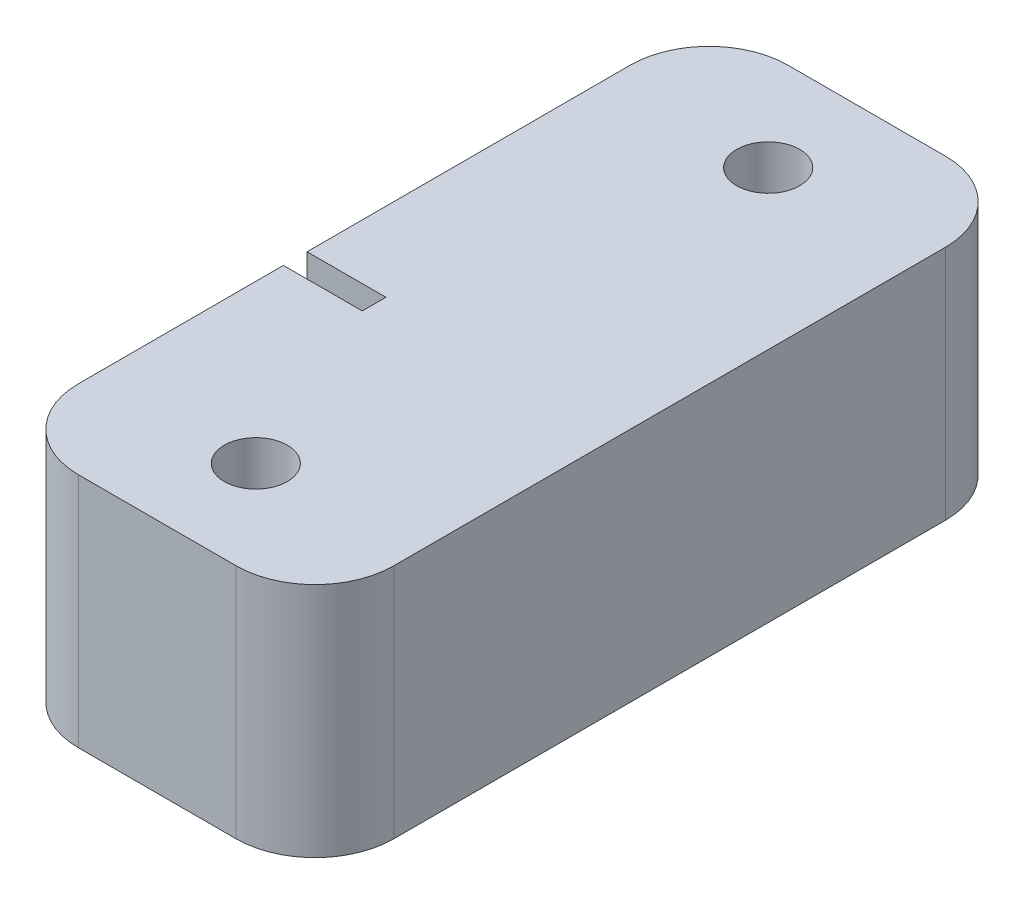
ISO-10303-21;
HEADER;
FILE_DESCRIPTION(('STEP AP214'),'2;1');
FILE_NAME('part.step','',(''),(''),'','','');
FILE_SCHEMA(('AUTOMOTIVE_DESIGN { 1 0 10303 214 1 1 1 1 }'));
ENDSEC;
DATA;
#1=APPLICATION_CONTEXT('core data for automotive mechanical design processes');
#2=APPLICATION_PROTOCOL_DEFINITION('international standard','automotive_design',2000,#1);
#3=PRODUCT_CONTEXT('',#1,'mechanical');
#4=PRODUCT('Part','Part','',(#3));
#5=PRODUCT_RELATED_PRODUCT_CATEGORY('part','',(#4));
#6=PRODUCT_DEFINITION_FORMATION('','',#4);
#7=PRODUCT_DEFINITION_CONTEXT('part definition',#1,'design');
#8=PRODUCT_DEFINITION('design','',#6,#7);
#9=PRODUCT_DEFINITION_SHAPE('','',#8);
#10=(LENGTH_UNIT() NAMED_UNIT(*) SI_UNIT(.MILLI.,.METRE.));
#11=(NAMED_UNIT(*) PLANE_ANGLE_UNIT() SI_UNIT($,.RADIAN.));
#12=(NAMED_UNIT(*) SI_UNIT($,.STERADIAN.) SOLID_ANGLE_UNIT());
#13=UNCERTAINTY_MEASURE_WITH_UNIT(LENGTH_MEASURE(1.E-05),#10,'distance_accuracy_value','');
#14=(GEOMETRIC_REPRESENTATION_CONTEXT(3) GLOBAL_UNCERTAINTY_ASSIGNED_CONTEXT((#13)) GLOBAL_UNIT_ASSIGNED_CONTEXT((#10,
#11,#12)) REPRESENTATION_CONTEXT('',''));
#15=CARTESIAN_POINT('',(0.,0.,0.));
#16=DIRECTION('',(0.,0.,1.));
#17=DIRECTION('',(1.,0.,0.));
#18=AXIS2_PLACEMENT_3D('',#15,#16,#17);
#19=CARTESIAN_POINT('',(-23.5223880597015,30.,-49.7611940298507));
#20=DIRECTION('',(1.,0.,0.));
#21=DIRECTION('',(0.,0.,-1.));
#22=AXIS2_PLACEMENT_3D('',#19,#20,#21);
#23=PLANE('',#22);
#24=DIRECTION('',(0.,0.,1.));
#25=VECTOR('',#24,1.);
#26=CARTESIAN_POINT('',(-23.5223880597015,30.,-49.7611940298507));
#27=LINE('',#26,#25);
#28=CARTESIAN_POINT('',(-23.5223880597015,30.,-39.7611940298507));
#29=VERTEX_POINT('',#28);
#30=CARTESIAN_POINT('',(-23.5223880597015,30.,1.23880597014926));
#31=VERTEX_POINT('',#30);
#32=EDGE_CURVE('E184',#29,#31,#27,.T.);
#33=ORIENTED_EDGE('',*,*,#32,.F.);
#34=DIRECTION('',(0.,-1.,0.));
#35=VECTOR('',#34,1.);
#36=CARTESIAN_POINT('',(-23.5223880597015,30.,-39.7611940298507));
#37=LINE('',#36,#35);
#38=CARTESIAN_POINT('',(-23.5223880597015,0.,-39.7611940298507));
#39=VERTEX_POINT('',#38);
#40=EDGE_CURVE('E206',#29,#39,#37,.T.);
#41=ORIENTED_EDGE('',*,*,#40,.T.);
#42=DIRECTION('',(0.,0.,1.));
#43=VECTOR('',#42,1.);
#44=CARTESIAN_POINT('',(-23.5223880597015,0.,-49.7611940298507));
#45=LINE('',#44,#43);
#46=CARTESIAN_POINT('',(-23.5223880597015,0.,30.2388059701492));
#47=VERTEX_POINT('',#46);
#48=EDGE_CURVE('E175',#39,#47,#45,.T.);
#49=ORIENTED_EDGE('',*,*,#48,.T.);
#50=DIRECTION('',(0.,-1.,0.));
#51=VECTOR('',#50,1.);
#52=CARTESIAN_POINT('',(-23.5223880597015,30.,30.2388059701492));
#53=LINE('',#52,#51);
#54=CARTESIAN_POINT('',(-23.5223880597015,30.,30.2388059701492));
#55=VERTEX_POINT('',#54);
#56=EDGE_CURVE('E194',#47,#55,#53,.F.);
#57=ORIENTED_EDGE('',*,*,#56,.T.);
#58=CARTESIAN_POINT('',(-23.5223880597015,30.,4.23880597014926));
#59=VERTEX_POINT('',#58);
#60=EDGE_CURVE('E187',#59,#55,#27,.T.);
#61=ORIENTED_EDGE('',*,*,#60,.F.);
#62=DIRECTION('',(0.,-1.,0.));
#63=VECTOR('',#62,1.);
#64=CARTESIAN_POINT('',(-23.5223880597015,0.,4.23880597014926));
#65=LINE('',#64,#63);
#66=CARTESIAN_POINT('',(-23.5223880597015,18.7080992435478,4.23880597014926));
#67=VERTEX_POINT('',#66);
#68=EDGE_CURVE('E153',#59,#67,#65,.T.);
#69=ORIENTED_EDGE('',*,*,#68,.T.);
#70=CARTESIAN_POINT('',(-23.5223880597015,15.,2.73880597014926));
#71=DIRECTION('',(-1.,0.,0.));
#72=DIRECTION('',(0.,0.,1.));
#73=AXIS2_PLACEMENT_3D('',#70,#71,#72);
#74=CIRCLE('',#73,4.);
#75=CARTESIAN_POINT('',(-23.5223880597015,18.7080992435478,1.23880597014926));
#76=VERTEX_POINT('',#75);
#77=EDGE_CURVE('E161',#76,#67,#74,.T.);
#78=ORIENTED_EDGE('',*,*,#77,.F.);
#79=DIRECTION('',(0.,-1.,0.));
#80=VECTOR('',#79,1.);
#81=CARTESIAN_POINT('',(-23.5223880597015,0.,1.23880597014926));
#82=LINE('',#81,#80);
#83=EDGE_CURVE('E131',#31,#76,#82,.T.);
#84=ORIENTED_EDGE('',*,*,#83,.F.);
#85=EDGE_LOOP('',(#33,#41,#49,#57,#61,#69,#78,#84));
#86=FACE_BOUND('',#85,.T.);
#87=ADVANCED_FACE('F34',(#86),#23,.F.);
#88=CARTESIAN_POINT('',(-23.5223880597015,30.,40.2388059701493));
#89=DIRECTION('',(0.,0.,-1.));
#90=DIRECTION('',(-1.,0.,0.));
#91=AXIS2_PLACEMENT_3D('',#88,#89,#90);
#92=PLANE('',#91);
#93=DIRECTION('',(1.,0.,0.));
#94=VECTOR('',#93,1.);
#95=CARTESIAN_POINT('',(-23.5223880597015,0.,40.2388059701493));
#96=LINE('',#95,#94);
#97=CARTESIAN_POINT('',(-13.5223880597015,0.,40.2388059701493));
#98=VERTEX_POINT('',#97);
#99=CARTESIAN_POINT('',(6.47761194029854,0.,40.2388059701493));
#100=VERTEX_POINT('',#99);
#101=EDGE_CURVE('E197',#98,#100,#96,.T.);
#102=ORIENTED_EDGE('',*,*,#101,.T.);
#103=DIRECTION('',(0.,-1.,0.));
#104=VECTOR('',#103,1.);
#105=CARTESIAN_POINT('',(6.47761194029854,30.,40.2388059701493));
#106=LINE('',#105,#104);
#107=CARTESIAN_POINT('',(6.47761194029854,30.,40.2388059701493));
#108=VERTEX_POINT('',#107);
#109=EDGE_CURVE('E11',#100,#108,#106,.F.);
#110=ORIENTED_EDGE('',*,*,#109,.T.);
#111=DIRECTION('',(1.,0.,0.));
#112=VECTOR('',#111,1.);
#113=CARTESIAN_POINT('',(-23.5223880597015,30.,40.2388059701493));
#114=LINE('',#113,#112);
#115=CARTESIAN_POINT('',(-13.5223880597015,30.,40.2388059701493));
#116=VERTEX_POINT('',#115);
#117=EDGE_CURVE('E186',#116,#108,#114,.T.);
#118=ORIENTED_EDGE('',*,*,#117,.F.);
#119=DIRECTION('',(0.,-1.,0.));
#120=VECTOR('',#119,1.);
#121=CARTESIAN_POINT('',(-13.5223880597015,30.,40.2388059701493));
#122=LINE('',#121,#120);
#123=EDGE_CURVE('E42',#116,#98,#122,.T.);
#124=ORIENTED_EDGE('',*,*,#123,.T.);
#125=EDGE_LOOP('',(#102,#110,#118,#124));
#126=FACE_BOUND('',#125,.T.);
#127=ADVANCED_FACE('F237',(#126),#92,.F.);
#128=CARTESIAN_POINT('',(16.4776119402985,30.,-49.7611940298507));
#129=DIRECTION('',(-1.,0.,0.));
#130=DIRECTION('',(0.,0.,1.));
#131=AXIS2_PLACEMENT_3D('',#128,#129,#130);
#132=PLANE('',#131);
#133=DIRECTION('',(0.,0.,-1.));
#134=VECTOR('',#133,1.);
#135=CARTESIAN_POINT('',(16.4776119402985,0.,-49.7611940298507));
#136=LINE('',#135,#134);
#137=CARTESIAN_POINT('',(16.4776119402985,0.,30.2388059701492));
#138=VERTEX_POINT('',#137);
#139=CARTESIAN_POINT('',(16.4776119402985,0.,-39.7611940298507));
#140=VERTEX_POINT('',#139);
#141=EDGE_CURVE('E200',#138,#140,#136,.T.);
#142=ORIENTED_EDGE('',*,*,#141,.T.);
#143=DIRECTION('',(0.,-1.,0.));
#144=VECTOR('',#143,1.);
#145=CARTESIAN_POINT('',(16.4776119402985,30.,-39.7611940298507));
#146=LINE('',#145,#144);
#147=CARTESIAN_POINT('',(16.4776119402985,30.,-39.7611940298507));
#148=VERTEX_POINT('',#147);
#149=EDGE_CURVE('E49',#140,#148,#146,.F.);
#150=ORIENTED_EDGE('',*,*,#149,.T.);
#151=DIRECTION('',(0.,0.,-1.));
#152=VECTOR('',#151,1.);
#153=CARTESIAN_POINT('',(16.4776119402985,30.,-49.7611940298507));
#154=LINE('',#153,#152);
#155=CARTESIAN_POINT('',(16.4776119402985,30.,30.2388059701492));
#156=VERTEX_POINT('',#155);
#157=EDGE_CURVE('E189',#156,#148,#154,.T.);
#158=ORIENTED_EDGE('',*,*,#157,.F.);
#159=DIRECTION('',(0.,-1.,0.));
#160=VECTOR('',#159,1.);
#161=CARTESIAN_POINT('',(16.4776119402985,30.,30.2388059701492));
#162=LINE('',#161,#160);
#163=EDGE_CURVE('E229',#156,#138,#162,.T.);
#164=ORIENTED_EDGE('',*,*,#163,.T.);
#165=EDGE_LOOP('',(#142,#150,#158,#164));
#166=FACE_BOUND('',#165,.T.);
#167=ADVANCED_FACE('F248',(#166),#132,.F.);
#168=CARTESIAN_POINT('',(-23.5223880597015,30.,-49.7611940298507));
#169=DIRECTION('',(0.,0.,1.));
#170=DIRECTION('',(1.,0.,0.));
#171=AXIS2_PLACEMENT_3D('',#168,#169,#170);
#172=PLANE('',#171);
#173=DIRECTION('',(-1.,0.,0.));
#174=VECTOR('',#173,1.);
#175=CARTESIAN_POINT('',(-23.5223880597015,0.,-49.7611940298507));
#176=LINE('',#175,#174);
#177=CARTESIAN_POINT('',(6.47761194029853,0.,-49.7611940298507));
#178=VERTEX_POINT('',#177);
#179=CARTESIAN_POINT('',(-13.5223880597015,0.,-49.7611940298507));
#180=VERTEX_POINT('',#179);
#181=EDGE_CURVE('E202',#178,#180,#176,.T.);
#182=ORIENTED_EDGE('',*,*,#181,.T.);
#183=DIRECTION('',(0.,-1.,0.));
#184=VECTOR('',#183,1.);
#185=CARTESIAN_POINT('',(-13.5223880597015,30.,-49.7611940298507));
#186=LINE('',#185,#184);
#187=CARTESIAN_POINT('',(-13.5223880597015,30.,-49.7611940298507));
#188=VERTEX_POINT('',#187);
#189=EDGE_CURVE('E220',#180,#188,#186,.F.);
#190=ORIENTED_EDGE('',*,*,#189,.T.);
#191=DIRECTION('',(-1.,0.,0.));
#192=VECTOR('',#191,1.);
#193=CARTESIAN_POINT('',(-23.5223880597015,30.,-49.7611940298507));
#194=LINE('',#193,#192);
#195=CARTESIAN_POINT('',(6.47761194029853,30.,-49.7611940298507));
#196=VERTEX_POINT('',#195);
#197=EDGE_CURVE('E191',#196,#188,#194,.T.);
#198=ORIENTED_EDGE('',*,*,#197,.F.);
#199=DIRECTION('',(0.,-1.,0.));
#200=VECTOR('',#199,1.);
#201=CARTESIAN_POINT('',(6.47761194029853,30.,-49.7611940298507));
#202=LINE('',#201,#200);
#203=EDGE_CURVE('E217',#196,#178,#202,.T.);
#204=ORIENTED_EDGE('',*,*,#203,.T.);
#205=EDGE_LOOP('',(#182,#190,#198,#204));
#206=FACE_BOUND('',#205,.T.);
#207=ADVANCED_FACE('F258',(#206),#172,.F.);
#208=CARTESIAN_POINT('',(0.,30.,0.));
#209=DIRECTION('',(0.,1.,0.));
#210=DIRECTION('',(0.,0.,1.));
#211=AXIS2_PLACEMENT_3D('',#208,#209,#210);
#212=PLANE('',#211);
#213=ORIENTED_EDGE('',*,*,#197,.T.);
#214=CARTESIAN_POINT('',(-13.5223880597015,30.,-39.7611940298507));
#215=DIRECTION('',(0.,1.,0.));
#216=DIRECTION('',(0.,0.,1.));
#217=AXIS2_PLACEMENT_3D('',#214,#215,#216);
#218=CIRCLE('',#217,10.);
#219=EDGE_CURVE('E227',#188,#29,#218,.T.);
#220=ORIENTED_EDGE('',*,*,#219,.T.);
#221=ORIENTED_EDGE('',*,*,#32,.T.);
#222=DIRECTION('',(-1.,0.,0.));
#223=VECTOR('',#222,1.);
#224=CARTESIAN_POINT('',(-13.5223880597015,30.,1.23880597014926));
#225=LINE('',#224,#223);
#226=CARTESIAN_POINT('',(-13.5223880597015,30.,1.23880597014926));
#227=VERTEX_POINT('',#226);
#228=EDGE_CURVE('E165',#227,#31,#225,.T.);
#229=ORIENTED_EDGE('',*,*,#228,.F.);
#230=DIRECTION('',(0.,0.,-1.));
#231=VECTOR('',#230,1.);
#232=CARTESIAN_POINT('',(-13.5223880597015,30.,0.));
#233=LINE('',#232,#231);
#234=CARTESIAN_POINT('',(-13.5223880597015,30.,4.23880597014926));
#235=VERTEX_POINT('',#234);
#236=EDGE_CURVE('E148',#235,#227,#233,.T.);
#237=ORIENTED_EDGE('',*,*,#236,.F.);
#238=DIRECTION('',(-1.,0.,0.));
#239=VECTOR('',#238,1.);
#240=CARTESIAN_POINT('',(-13.5223880597015,30.,4.23880597014926));
#241=LINE('',#240,#239);
#242=EDGE_CURVE('E168',#235,#59,#241,.T.);
#243=ORIENTED_EDGE('',*,*,#242,.T.);
#244=ORIENTED_EDGE('',*,*,#60,.T.);
#245=CARTESIAN_POINT('',(-13.5223880597015,30.,30.2388059701493));
#246=DIRECTION('',(0.,1.,0.));
#247=DIRECTION('',(0.,0.,1.));
#248=AXIS2_PLACEMENT_3D('',#245,#246,#247);
#249=CIRCLE('',#248,10.);
#250=EDGE_CURVE('E222',#55,#116,#249,.T.);
#251=ORIENTED_EDGE('',*,*,#250,.T.);
#252=ORIENTED_EDGE('',*,*,#117,.T.);
#253=CARTESIAN_POINT('',(6.47761194029854,30.,30.2388059701492));
#254=DIRECTION('',(0.,1.,0.));
#255=DIRECTION('',(0.,0.,1.));
#256=AXIS2_PLACEMENT_3D('',#253,#254,#255);
#257=CIRCLE('',#256,10.);
#258=EDGE_CURVE('E56',#108,#156,#257,.T.);
#259=ORIENTED_EDGE('',*,*,#258,.T.);
#260=ORIENTED_EDGE('',*,*,#157,.T.);
#261=CARTESIAN_POINT('',(6.47761194029853,30.,-39.7611940298507));
#262=DIRECTION('',(0.,1.,0.));
#263=DIRECTION('',(0.,0.,1.));
#264=AXIS2_PLACEMENT_3D('',#261,#262,#263);
#265=CIRCLE('',#264,10.);
#266=EDGE_CURVE('E225',#148,#196,#265,.T.);
#267=ORIENTED_EDGE('',*,*,#266,.T.);
#268=EDGE_LOOP('',(#213,#220,#221,#229,#237,#243,#244,#251,#252,#259,#260,#267));
#269=FACE_BOUND('',#268,.T.);
#270=CARTESIAN_POINT('',(-3.52238805970146,30.,-37.2611940298507));
#271=DIRECTION('',(0.,1.,0.));
#272=DIRECTION('',(0.,0.,1.));
#273=AXIS2_PLACEMENT_3D('',#270,#271,#272);
#274=CIRCLE('',#273,4.);
#275=CARTESIAN_POINT('',(-3.52238805970146,30.,-33.2611940298507));
#276=VERTEX_POINT('',#275);
#277=EDGE_CURVE('E176',#276,#276,#274,.T.);
#278=ORIENTED_EDGE('',*,*,#277,.F.);
#279=EDGE_LOOP('',(#278));
#280=FACE_BOUND('',#279,.T.);
#281=CARTESIAN_POINT('',(-3.52238805970146,30.,27.7388059701493));
#282=DIRECTION('',(0.,1.,0.));
#283=DIRECTION('',(0.,0.,1.));
#284=AXIS2_PLACEMENT_3D('',#281,#282,#283);
#285=CIRCLE('',#284,4.);
#286=CARTESIAN_POINT('',(-3.52238805970146,30.,31.7388059701493));
#287=VERTEX_POINT('',#286);
#288=EDGE_CURVE('E167',#287,#287,#285,.T.);
#289=ORIENTED_EDGE('',*,*,#288,.F.);
#290=EDGE_LOOP('',(#289));
#291=FACE_BOUND('',#290,.T.);
#292=ADVANCED_FACE('F250',(#269,#280,#291),#212,.T.);
#293=CARTESIAN_POINT('',(0.,0.,0.));
#294=DIRECTION('',(0.,1.,0.));
#295=DIRECTION('',(0.,0.,1.));
#296=AXIS2_PLACEMENT_3D('',#293,#294,#295);
#297=PLANE('',#296);
#298=ORIENTED_EDGE('',*,*,#48,.F.);
#299=CARTESIAN_POINT('',(-13.5223880597015,0.,-39.7611940298507));
#300=DIRECTION('',(0.,1.,0.));
#301=DIRECTION('',(0.,0.,1.));
#302=AXIS2_PLACEMENT_3D('',#299,#300,#301);
#303=CIRCLE('',#302,10.);
#304=EDGE_CURVE('E215',#39,#180,#303,.F.);
#305=ORIENTED_EDGE('',*,*,#304,.T.);
#306=ORIENTED_EDGE('',*,*,#181,.F.);
#307=CARTESIAN_POINT('',(6.47761194029853,0.,-39.7611940298507));
#308=DIRECTION('',(0.,1.,0.));
#309=DIRECTION('',(0.,0.,1.));
#310=AXIS2_PLACEMENT_3D('',#307,#308,#309);
#311=CIRCLE('',#310,10.);
#312=EDGE_CURVE('E213',#178,#140,#311,.F.);
#313=ORIENTED_EDGE('',*,*,#312,.T.);
#314=ORIENTED_EDGE('',*,*,#141,.F.);
#315=CARTESIAN_POINT('',(6.47761194029854,0.,30.2388059701492));
#316=DIRECTION('',(0.,1.,0.));
#317=DIRECTION('',(0.,0.,1.));
#318=AXIS2_PLACEMENT_3D('',#315,#316,#317);
#319=CIRCLE('',#318,10.);
#320=EDGE_CURVE('E211',#138,#100,#319,.F.);
#321=ORIENTED_EDGE('',*,*,#320,.T.);
#322=ORIENTED_EDGE('',*,*,#101,.F.);
#323=CARTESIAN_POINT('',(-13.5223880597015,0.,30.2388059701493));
#324=DIRECTION('',(0.,1.,0.));
#325=DIRECTION('',(0.,0.,1.));
#326=AXIS2_PLACEMENT_3D('',#323,#324,#325);
#327=CIRCLE('',#326,10.);
#328=EDGE_CURVE('E209',#98,#47,#327,.F.);
#329=ORIENTED_EDGE('',*,*,#328,.T.);
#330=EDGE_LOOP('',(#298,#305,#306,#313,#314,#321,#322,#329));
#331=FACE_BOUND('',#330,.T.);
#332=ADVANCED_FACE('F243',(#331),#297,.F.);
#333=CARTESIAN_POINT('',(-3.52238805970146,10.,27.7388059701493));
#334=DIRECTION('',(0.,1.,0.));
#335=DIRECTION('',(0.,0.,1.));
#336=AXIS2_PLACEMENT_3D('',#333,#334,#335);
#337=CYLINDRICAL_SURFACE('',#336,4.);
#338=CARTESIAN_POINT('',(-3.52238805970146,10.,27.7388059701493));
#339=DIRECTION('',(0.,1.,0.));
#340=DIRECTION('',(0.,0.,1.));
#341=AXIS2_PLACEMENT_3D('',#338,#339,#340);
#342=CIRCLE('',#341,4.);
#343=CARTESIAN_POINT('',(-3.52238805970146,10.,31.7388059701493));
#344=VERTEX_POINT('',#343);
#345=EDGE_CURVE('E179',#344,#344,#342,.T.);
#346=ORIENTED_EDGE('',*,*,#345,.F.);
#347=EDGE_LOOP('',(#346));
#348=FACE_BOUND('',#347,.T.);
#349=ORIENTED_EDGE('',*,*,#288,.T.);
#350=EDGE_LOOP('',(#349));
#351=FACE_BOUND('',#350,.T.);
#352=ADVANCED_FACE('F317',(#348,#351),#337,.F.);
#353=CARTESIAN_POINT('',(-3.52238805970146,10.,27.7388059701493));
#354=DIRECTION('',(0.,1.,0.));
#355=DIRECTION('',(0.,0.,1.));
#356=AXIS2_PLACEMENT_3D('',#353,#354,#355);
#357=PLANE('',#356);
#358=ORIENTED_EDGE('',*,*,#345,.T.);
#359=EDGE_LOOP('',(#358));
#360=FACE_BOUND('',#359,.T.);
#361=ADVANCED_FACE('F313',(#360),#357,.T.);
#362=CARTESIAN_POINT('',(-3.52238805970146,10.,-37.2611940298507));
#363=DIRECTION('',(0.,1.,0.));
#364=DIRECTION('',(0.,0.,1.));
#365=AXIS2_PLACEMENT_3D('',#362,#363,#364);
#366=CYLINDRICAL_SURFACE('',#365,4.);
#367=CARTESIAN_POINT('',(-3.52238805970146,10.,-37.2611940298507));
#368=DIRECTION('',(0.,1.,0.));
#369=DIRECTION('',(0.,0.,1.));
#370=AXIS2_PLACEMENT_3D('',#367,#368,#369);
#371=CIRCLE('',#370,4.);
#372=CARTESIAN_POINT('',(-3.52238805970146,10.,-33.2611940298507));
#373=VERTEX_POINT('',#372);
#374=EDGE_CURVE('E172',#373,#373,#371,.T.);
#375=ORIENTED_EDGE('',*,*,#374,.F.);
#376=EDGE_LOOP('',(#375));
#377=FACE_BOUND('',#376,.T.);
#378=ORIENTED_EDGE('',*,*,#277,.T.);
#379=EDGE_LOOP('',(#378));
#380=FACE_BOUND('',#379,.T.);
#381=ADVANCED_FACE('F309',(#377,#380),#366,.F.);
#382=CARTESIAN_POINT('',(-3.52238805970146,10.,-37.2611940298507));
#383=DIRECTION('',(0.,1.,0.));
#384=DIRECTION('',(0.,0.,1.));
#385=AXIS2_PLACEMENT_3D('',#382,#383,#384);
#386=PLANE('',#385);
#387=ORIENTED_EDGE('',*,*,#374,.T.);
#388=EDGE_LOOP('',(#387));
#389=FACE_BOUND('',#388,.T.);
#390=ADVANCED_FACE('F306',(#389),#386,.T.);
#391=CARTESIAN_POINT('',(-13.5223880597015,0.,1.23880597014926));
#392=DIRECTION('',(0.,0.,-1.));
#393=DIRECTION('',(-1.,0.,0.));
#394=AXIS2_PLACEMENT_3D('',#391,#392,#393);
#395=PLANE('',#394);
#396=ORIENTED_EDGE('',*,*,#83,.T.);
#397=DIRECTION('',(-1.,0.,0.));
#398=VECTOR('',#397,1.);
#399=CARTESIAN_POINT('',(-13.5223880597015,18.7080992435478,1.23880597014926));
#400=LINE('',#399,#398);
#401=CARTESIAN_POINT('',(-13.5223880597015,18.7080992435478,1.23880597014926));
#402=VERTEX_POINT('',#401);
#403=EDGE_CURVE('E123',#402,#76,#400,.T.);
#404=ORIENTED_EDGE('',*,*,#403,.F.);
#405=DIRECTION('',(0.,-1.,0.));
#406=VECTOR('',#405,1.);
#407=CARTESIAN_POINT('',(-13.5223880597015,0.,1.23880597014926));
#408=LINE('',#407,#406);
#409=EDGE_CURVE('E128',#227,#402,#408,.T.);
#410=ORIENTED_EDGE('',*,*,#409,.F.);
#411=ORIENTED_EDGE('',*,*,#228,.T.);
#412=EDGE_LOOP('',(#396,#404,#410,#411));
#413=FACE_BOUND('',#412,.T.);
#414=ADVANCED_FACE('F125',(#413),#395,.F.);
#415=CARTESIAN_POINT('',(-13.5223880597015,0.,4.23880597014926));
#416=DIRECTION('',(0.,0.,-1.));
#417=DIRECTION('',(0.,1.,0.));
#418=AXIS2_PLACEMENT_3D('',#415,#416,#417);
#419=PLANE('',#418);
#420=ORIENTED_EDGE('',*,*,#68,.F.);
#421=ORIENTED_EDGE('',*,*,#242,.F.);
#422=DIRECTION('',(0.,-1.,0.));
#423=VECTOR('',#422,1.);
#424=CARTESIAN_POINT('',(-13.5223880597015,0.,4.23880597014926));
#425=LINE('',#424,#423);
#426=CARTESIAN_POINT('',(-13.5223880597015,18.7080992435478,4.23880597014926));
#427=VERTEX_POINT('',#426);
#428=EDGE_CURVE('E143',#235,#427,#425,.T.);
#429=ORIENTED_EDGE('',*,*,#428,.T.);
#430=DIRECTION('',(-1.,0.,0.));
#431=VECTOR('',#430,1.);
#432=CARTESIAN_POINT('',(-13.5223880597015,18.7080992435478,4.23880597014926));
#433=LINE('',#432,#431);
#434=EDGE_CURVE('E135',#427,#67,#433,.T.);
#435=ORIENTED_EDGE('',*,*,#434,.T.);
#436=EDGE_LOOP('',(#420,#421,#429,#435));
#437=FACE_BOUND('',#436,.T.);
#438=ADVANCED_FACE('F299',(#437),#419,.T.);
#439=CARTESIAN_POINT('',(-13.5223880597015,15.,2.73880597014926));
#440=DIRECTION('',(-1.,0.,0.));
#441=DIRECTION('',(0.,0.,1.));
#442=AXIS2_PLACEMENT_3D('',#439,#440,#441);
#443=CYLINDRICAL_SURFACE('',#442,4.);
#444=ORIENTED_EDGE('',*,*,#77,.T.);
#445=ORIENTED_EDGE('',*,*,#434,.F.);
#446=CARTESIAN_POINT('',(-13.5223880597015,15.,2.73880597014926));
#447=DIRECTION('',(-1.,0.,0.));
#448=DIRECTION('',(0.,0.,1.));
#449=AXIS2_PLACEMENT_3D('',#446,#447,#448);
#450=CIRCLE('',#449,4.);
#451=EDGE_CURVE('E140',#402,#427,#450,.T.);
#452=ORIENTED_EDGE('',*,*,#451,.F.);
#453=ORIENTED_EDGE('',*,*,#403,.T.);
#454=EDGE_LOOP('',(#444,#445,#452,#453));
#455=FACE_BOUND('',#454,.T.);
#456=ADVANCED_FACE('F141',(#455),#443,.F.);
#457=CARTESIAN_POINT('',(-13.5223880597015,15.,2.73880597014926));
#458=DIRECTION('',(-1.,0.,0.));
#459=DIRECTION('',(0.,0.,1.));
#460=AXIS2_PLACEMENT_3D('',#457,#458,#459);
#461=CYLINDRICAL_SURFACE('',#460,2.5);
#462=CARTESIAN_POINT('',(-13.5223880597015,15.,2.73880597014926));
#463=DIRECTION('',(-1.,0.,0.));
#464=DIRECTION('',(0.,0.,1.));
#465=AXIS2_PLACEMENT_3D('',#462,#463,#464);
#466=CIRCLE('',#465,2.5);
#467=CARTESIAN_POINT('',(-13.5223880597015,15.,5.23880597014926));
#468=VERTEX_POINT('',#467);
#469=EDGE_CURVE('E136',#468,#468,#466,.T.);
#470=ORIENTED_EDGE('',*,*,#469,.T.);
#471=EDGE_LOOP('',(#470));
#472=FACE_BOUND('',#471,.T.);
#473=CARTESIAN_POINT('',(-23.5223880597015,15.,2.73880597014926));
#474=DIRECTION('',(-1.,0.,0.));
#475=DIRECTION('',(0.,0.,1.));
#476=AXIS2_PLACEMENT_3D('',#473,#474,#475);
#477=CIRCLE('',#476,2.5);
#478=CARTESIAN_POINT('',(-23.5223880597015,15.,5.23880597014926));
#479=VERTEX_POINT('',#478);
#480=EDGE_CURVE('E150',#479,#479,#477,.T.);
#481=ORIENTED_EDGE('',*,*,#480,.F.);
#482=EDGE_LOOP('',(#481));
#483=FACE_BOUND('',#482,.T.);
#484=ADVANCED_FACE('F289',(#472,#483),#461,.T.);
#485=CARTESIAN_POINT('',(-13.5223880597015,0.,0.));
#486=DIRECTION('',(-1.,0.,0.));
#487=DIRECTION('',(0.,0.,1.));
#488=AXIS2_PLACEMENT_3D('',#485,#486,#487);
#489=PLANE('',#488);
#490=ORIENTED_EDGE('',*,*,#409,.T.);
#491=ORIENTED_EDGE('',*,*,#451,.T.);
#492=ORIENTED_EDGE('',*,*,#428,.F.);
#493=ORIENTED_EDGE('',*,*,#236,.T.);
#494=EDGE_LOOP('',(#490,#491,#492,#493));
#495=FACE_BOUND('',#494,.T.);
#496=ORIENTED_EDGE('',*,*,#469,.F.);
#497=EDGE_LOOP('',(#496));
#498=FACE_BOUND('',#497,.T.);
#499=ADVANCED_FACE('F145',(#495,#498),#489,.T.);
#500=ORIENTED_EDGE('',*,*,#480,.T.);
#501=EDGE_LOOP('',(#500));
#502=FACE_BOUND('',#501,.T.);
#503=ADVANCED_FACE('F277',(#502),#23,.F.);
#504=CARTESIAN_POINT('',(-13.5223880597015,30.,-39.7611940298507));
#505=DIRECTION('',(0.,-1.,0.));
#506=DIRECTION('',(0.,0.,-1.));
#507=AXIS2_PLACEMENT_3D('',#504,#505,#506);
#508=CYLINDRICAL_SURFACE('',#507,10.);
#509=ORIENTED_EDGE('',*,*,#219,.F.);
#510=ORIENTED_EDGE('',*,*,#189,.F.);
#511=ORIENTED_EDGE('',*,*,#304,.F.);
#512=ORIENTED_EDGE('',*,*,#40,.F.);
#513=EDGE_LOOP('',(#509,#510,#511,#512));
#514=FACE_BOUND('',#513,.T.);
#515=ADVANCED_FACE('F263',(#514),#508,.T.);
#516=CARTESIAN_POINT('',(6.47761194029853,30.,-39.7611940298507));
#517=DIRECTION('',(0.,-1.,0.));
#518=DIRECTION('',(0.,0.,-1.));
#519=AXIS2_PLACEMENT_3D('',#516,#517,#518);
#520=CYLINDRICAL_SURFACE('',#519,10.);
#521=ORIENTED_EDGE('',*,*,#266,.F.);
#522=ORIENTED_EDGE('',*,*,#149,.F.);
#523=ORIENTED_EDGE('',*,*,#312,.F.);
#524=ORIENTED_EDGE('',*,*,#203,.F.);
#525=EDGE_LOOP('',(#521,#522,#523,#524));
#526=FACE_BOUND('',#525,.T.);
#527=ADVANCED_FACE('F255',(#526),#520,.T.);
#528=CARTESIAN_POINT('',(6.47761194029854,30.,30.2388059701492));
#529=DIRECTION('',(0.,-1.,0.));
#530=DIRECTION('',(0.,0.,-1.));
#531=AXIS2_PLACEMENT_3D('',#528,#529,#530);
#532=CYLINDRICAL_SURFACE('',#531,10.);
#533=ORIENTED_EDGE('',*,*,#258,.F.);
#534=ORIENTED_EDGE('',*,*,#109,.F.);
#535=ORIENTED_EDGE('',*,*,#320,.F.);
#536=ORIENTED_EDGE('',*,*,#163,.F.);
#537=EDGE_LOOP('',(#533,#534,#535,#536));
#538=FACE_BOUND('',#537,.T.);
#539=ADVANCED_FACE('F247',(#538),#532,.T.);
#540=CARTESIAN_POINT('',(-13.5223880597015,30.,30.2388059701493));
#541=DIRECTION('',(0.,-1.,0.));
#542=DIRECTION('',(0.,0.,-1.));
#543=AXIS2_PLACEMENT_3D('',#540,#541,#542);
#544=CYLINDRICAL_SURFACE('',#543,10.);
#545=ORIENTED_EDGE('',*,*,#250,.F.);
#546=ORIENTED_EDGE('',*,*,#56,.F.);
#547=ORIENTED_EDGE('',*,*,#328,.F.);
#548=ORIENTED_EDGE('',*,*,#123,.F.);
#549=EDGE_LOOP('',(#545,#546,#547,#548));
#550=FACE_BOUND('',#549,.T.);
#551=ADVANCED_FACE('F36',(#550),#544,.T.);
#552=CLOSED_SHELL('',(#87,#127,#167,#207,#292,#332,#352,#361,#381,#390,#414,#438,#456,#484,#499,
#503,#515,#527,#539,#551));
#553=MANIFOLD_SOLID_BREP('B2',#552);
#554=ADVANCED_BREP_SHAPE_REPRESENTATION('',(#18,#553),#14);
#555=SHAPE_DEFINITION_REPRESENTATION(#9,#554);
ENDSEC;
END-ISO-10303-21;
